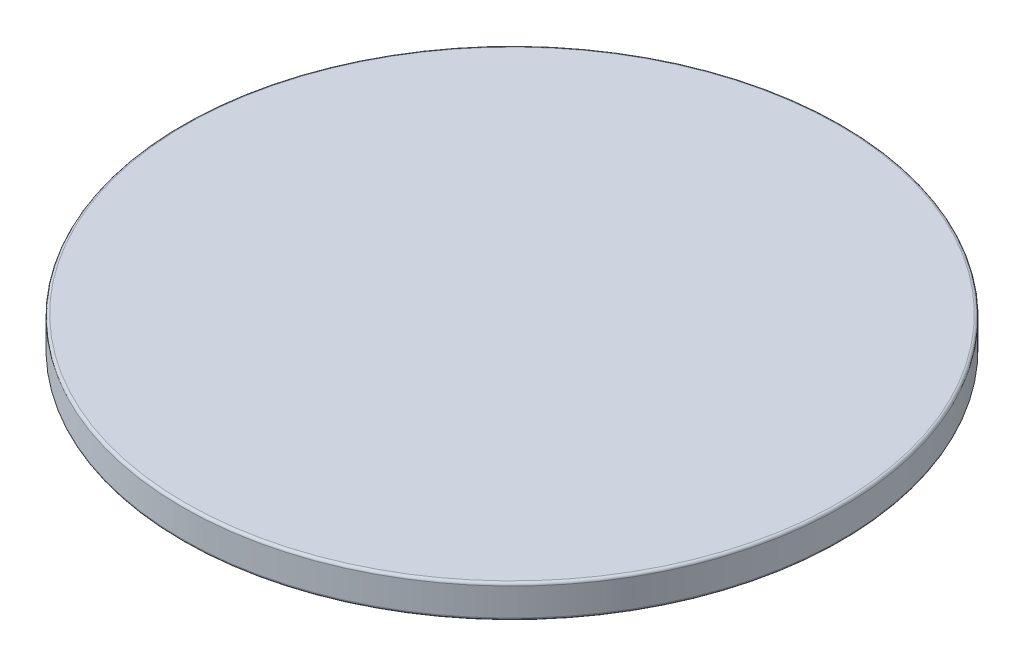
ISO-10303-21;
HEADER;
FILE_DESCRIPTION(('STEP AP214'),'2;1');
FILE_NAME('part.step','',(''),(''),'','','');
FILE_SCHEMA(('AUTOMOTIVE_DESIGN { 1 0 10303 214 1 1 1 1 }'));
ENDSEC;
DATA;
#1=APPLICATION_CONTEXT('core data for automotive mechanical design processes');
#2=APPLICATION_PROTOCOL_DEFINITION('international standard','automotive_design',2000,#1);
#3=PRODUCT_CONTEXT('',#1,'mechanical');
#4=PRODUCT('Part','Part','',(#3));
#5=PRODUCT_RELATED_PRODUCT_CATEGORY('part','',(#4));
#6=PRODUCT_DEFINITION_FORMATION('','',#4);
#7=PRODUCT_DEFINITION_CONTEXT('part definition',#1,'design');
#8=PRODUCT_DEFINITION('design','',#6,#7);
#9=PRODUCT_DEFINITION_SHAPE('','',#8);
#10=(LENGTH_UNIT() NAMED_UNIT(*) SI_UNIT(.MILLI.,.METRE.));
#11=(NAMED_UNIT(*) PLANE_ANGLE_UNIT() SI_UNIT($,.RADIAN.));
#12=(NAMED_UNIT(*) SI_UNIT($,.STERADIAN.) SOLID_ANGLE_UNIT());
#13=UNCERTAINTY_MEASURE_WITH_UNIT(LENGTH_MEASURE(1.E-05),#10,'distance_accuracy_value','');
#14=(GEOMETRIC_REPRESENTATION_CONTEXT(3) GLOBAL_UNCERTAINTY_ASSIGNED_CONTEXT((#13)) GLOBAL_UNIT_ASSIGNED_CONTEXT((#10,
#11,#12)) REPRESENTATION_CONTEXT('',''));
#15=CARTESIAN_POINT('',(0.,0.,0.));
#16=DIRECTION('',(0.,0.,1.));
#17=DIRECTION('',(1.,0.,0.));
#18=AXIS2_PLACEMENT_3D('',#15,#16,#17);
#19=CARTESIAN_POINT('',(0.,-25000.,0.));
#20=DIRECTION('',(0.,1.,0.));
#21=DIRECTION('',(0.,0.,1.));
#22=AXIS2_PLACEMENT_3D('',#19,#20,#21);
#23=CYLINDRICAL_SURFACE('',#22,250000.);
#24=CARTESIAN_POINT('',(0.,-2000.,0.));
#25=DIRECTION('',(0.,1.,0.));
#26=DIRECTION('',(0.,0.,1.));
#27=AXIS2_PLACEMENT_3D('',#24,#25,#26);
#28=CIRCLE('',#27,250000.);
#29=CARTESIAN_POINT('',(0.,-2000.,250000.));
#30=VERTEX_POINT('',#29);
#31=EDGE_CURVE('E41',#30,#30,#28,.F.);
#32=ORIENTED_EDGE('',*,*,#31,.T.);
#33=EDGE_LOOP('',(#32));
#34=FACE_BOUND('',#33,.T.);
#35=CARTESIAN_POINT('',(0.,-23000.,0.));
#36=DIRECTION('',(0.,1.,0.));
#37=DIRECTION('',(0.,0.,1.));
#38=AXIS2_PLACEMENT_3D('',#35,#36,#37);
#39=CIRCLE('',#38,250000.);
#40=CARTESIAN_POINT('',(0.,-23000.,250000.));
#41=VERTEX_POINT('',#40);
#42=EDGE_CURVE('E45',#41,#41,#39,.T.);
#43=ORIENTED_EDGE('',*,*,#42,.T.);
#44=EDGE_LOOP('',(#43));
#45=FACE_BOUND('',#44,.T.);
#46=ADVANCED_FACE('F34',(#34,#45),#23,.T.);
#47=CARTESIAN_POINT('',(0.,-25000.,0.));
#48=DIRECTION('',(0.,1.,0.));
#49=DIRECTION('',(0.,0.,1.));
#50=AXIS2_PLACEMENT_3D('',#47,#48,#49);
#51=PLANE('',#50);
#52=CARTESIAN_POINT('',(0.,-25000.,0.));
#53=DIRECTION('',(0.,1.,0.));
#54=DIRECTION('',(0.,0.,1.));
#55=AXIS2_PLACEMENT_3D('',#52,#53,#54);
#56=CIRCLE('',#55,248000.);
#57=CARTESIAN_POINT('',(0.,-25000.,248000.));
#58=VERTEX_POINT('',#57);
#59=EDGE_CURVE('E10',#58,#58,#56,.F.);
#60=ORIENTED_EDGE('',*,*,#59,.T.);
#61=EDGE_LOOP('',(#60));
#62=FACE_BOUND('',#61,.T.);
#63=ADVANCED_FACE('F65',(#62),#51,.F.);
#64=CARTESIAN_POINT('',(0.,0.,0.));
#65=DIRECTION('',(0.,1.,0.));
#66=DIRECTION('',(0.,0.,1.));
#67=AXIS2_PLACEMENT_3D('',#64,#65,#66);
#68=PLANE('',#67);
#69=CARTESIAN_POINT('',(0.,0.,0.));
#70=DIRECTION('',(0.,1.,0.));
#71=DIRECTION('',(0.,0.,1.));
#72=AXIS2_PLACEMENT_3D('',#69,#70,#71);
#73=CIRCLE('',#72,248000.);
#74=CARTESIAN_POINT('',(0.,0.,248000.));
#75=VERTEX_POINT('',#74);
#76=EDGE_CURVE('E49',#75,#75,#73,.T.);
#77=ORIENTED_EDGE('',*,*,#76,.T.);
#78=EDGE_LOOP('',(#77));
#79=FACE_BOUND('',#78,.T.);
#80=ADVANCED_FACE('F55',(#79),#68,.T.);
#81=CARTESIAN_POINT('',(0.,-2000.,0.));
#82=DIRECTION('',(0.,1.,0.));
#83=DIRECTION('',(0.,0.,1.));
#84=AXIS2_PLACEMENT_3D('',#81,#82,#83);
#85=TOROIDAL_SURFACE('',#84,248000.,2000.);
#86=ORIENTED_EDGE('',*,*,#31,.F.);
#87=EDGE_LOOP('',(#86));
#88=FACE_BOUND('',#87,.T.);
#89=ORIENTED_EDGE('',*,*,#76,.F.);
#90=EDGE_LOOP('',(#89));
#91=FACE_BOUND('',#90,.T.);
#92=ADVANCED_FACE('F57',(#88,#91),#85,.T.);
#93=CARTESIAN_POINT('',(0.,-23000.,0.));
#94=DIRECTION('',(0.,1.,0.));
#95=DIRECTION('',(0.,0.,1.));
#96=AXIS2_PLACEMENT_3D('',#93,#94,#95);
#97=TOROIDAL_SURFACE('',#96,248000.,2000.);
#98=ORIENTED_EDGE('',*,*,#59,.F.);
#99=EDGE_LOOP('',(#98));
#100=FACE_BOUND('',#99,.T.);
#101=ORIENTED_EDGE('',*,*,#42,.F.);
#102=EDGE_LOOP('',(#101));
#103=FACE_BOUND('',#102,.T.);
#104=ADVANCED_FACE('F36',(#100,#103),#97,.T.);
#105=CLOSED_SHELL('',(#46,#63,#80,#92,#104));
#106=MANIFOLD_SOLID_BREP('B2',#105);
#107=ADVANCED_BREP_SHAPE_REPRESENTATION('',(#18,#106),#14);
#108=SHAPE_DEFINITION_REPRESENTATION(#9,#107);
ENDSEC;
END-ISO-10303-21;
